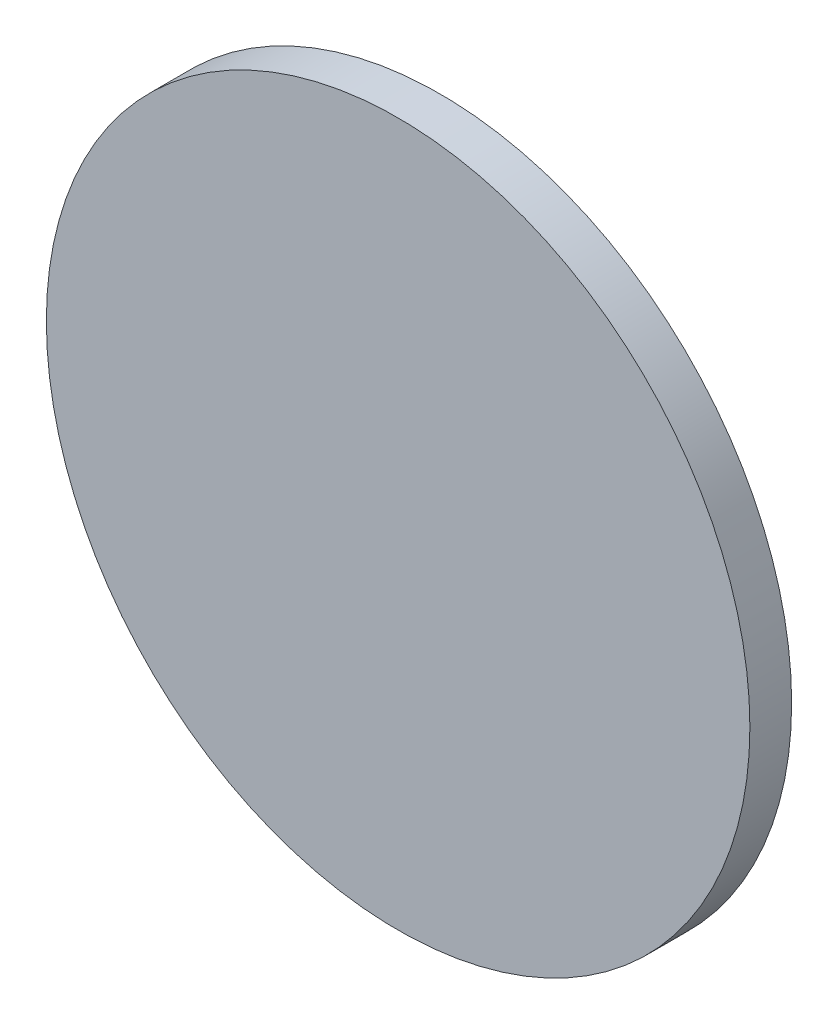
ISO-10303-21;
HEADER;
FILE_DESCRIPTION(('STEP AP214'),'2;1');
FILE_NAME('part.step','',(''),(''),'','','');
FILE_SCHEMA(('AUTOMOTIVE_DESIGN { 1 0 10303 214 1 1 1 1 }'));
ENDSEC;
DATA;
#1=APPLICATION_CONTEXT('core data for automotive mechanical design processes');
#2=APPLICATION_PROTOCOL_DEFINITION('international standard','automotive_design',2000,#1);
#3=PRODUCT_CONTEXT('',#1,'mechanical');
#4=PRODUCT('Part','Part','',(#3));
#5=PRODUCT_RELATED_PRODUCT_CATEGORY('part','',(#4));
#6=PRODUCT_DEFINITION_FORMATION('','',#4);
#7=PRODUCT_DEFINITION_CONTEXT('part definition',#1,'design');
#8=PRODUCT_DEFINITION('design','',#6,#7);
#9=PRODUCT_DEFINITION_SHAPE('','',#8);
#10=(LENGTH_UNIT() NAMED_UNIT(*) SI_UNIT(.MILLI.,.METRE.));
#11=(NAMED_UNIT(*) PLANE_ANGLE_UNIT() SI_UNIT($,.RADIAN.));
#12=(NAMED_UNIT(*) SI_UNIT($,.STERADIAN.) SOLID_ANGLE_UNIT());
#13=UNCERTAINTY_MEASURE_WITH_UNIT(LENGTH_MEASURE(1.E-05),#10,'distance_accuracy_value','');
#14=(GEOMETRIC_REPRESENTATION_CONTEXT(3) GLOBAL_UNCERTAINTY_ASSIGNED_CONTEXT((#13)) GLOBAL_UNIT_ASSIGNED_CONTEXT((#10,
#11,#12)) REPRESENTATION_CONTEXT('',''));
#15=CARTESIAN_POINT('',(0.,0.,0.));
#16=DIRECTION('',(0.,0.,1.));
#17=DIRECTION('',(1.,0.,0.));
#18=AXIS2_PLACEMENT_3D('',#15,#16,#17);
#19=CARTESIAN_POINT('',(0.,0.,10.));
#20=DIRECTION('',(0.,0.,-1.));
#21=DIRECTION('',(-1.,0.,0.));
#22=AXIS2_PLACEMENT_3D('',#19,#20,#21);
#23=CYLINDRICAL_SURFACE('',#22,84.251016630489);
#24=CARTESIAN_POINT('',(0.,0.,10.));
#25=DIRECTION('',(0.,0.,1.));
#26=DIRECTION('',(1.,0.,0.));
#27=AXIS2_PLACEMENT_3D('',#24,#25,#26);
#28=CIRCLE('',#27,84.251016630489);
#29=CARTESIAN_POINT('',(84.251016630489,0.,10.));
#30=VERTEX_POINT('',#29);
#31=EDGE_CURVE('E10',#30,#30,#28,.T.);
#32=ORIENTED_EDGE('',*,*,#31,.F.);
#33=EDGE_LOOP('',(#32));
#34=FACE_BOUND('',#33,.T.);
#35=CARTESIAN_POINT('',(0.,0.,0.));
#36=DIRECTION('',(0.,0.,1.));
#37=DIRECTION('',(1.,0.,0.));
#38=AXIS2_PLACEMENT_3D('',#35,#36,#37);
#39=CIRCLE('',#38,84.251016630489);
#40=CARTESIAN_POINT('',(84.251016630489,0.,0.));
#41=VERTEX_POINT('',#40);
#42=EDGE_CURVE('E34',#41,#41,#39,.T.);
#43=ORIENTED_EDGE('',*,*,#42,.T.);
#44=EDGE_LOOP('',(#43));
#45=FACE_BOUND('',#44,.T.);
#46=ADVANCED_FACE('F31',(#34,#45),#23,.T.);
#47=CARTESIAN_POINT('',(0.,0.,10.));
#48=DIRECTION('',(0.,0.,1.));
#49=DIRECTION('',(1.,0.,0.));
#50=AXIS2_PLACEMENT_3D('',#47,#48,#49);
#51=PLANE('',#50);
#52=ORIENTED_EDGE('',*,*,#31,.T.);
#53=EDGE_LOOP('',(#52));
#54=FACE_BOUND('',#53,.T.);
#55=ADVANCED_FACE('F46',(#54),#51,.T.);
#56=CARTESIAN_POINT('',(0.,0.,0.));
#57=DIRECTION('',(0.,0.,1.));
#58=DIRECTION('',(1.,0.,0.));
#59=AXIS2_PLACEMENT_3D('',#56,#57,#58);
#60=PLANE('',#59);
#61=ORIENTED_EDGE('',*,*,#42,.F.);
#62=EDGE_LOOP('',(#61));
#63=FACE_BOUND('',#62,.T.);
#64=ADVANCED_FACE('F44',(#63),#60,.F.);
#65=CLOSED_SHELL('',(#46,#55,#64));
#66=MANIFOLD_SOLID_BREP('B2',#65);
#67=ADVANCED_BREP_SHAPE_REPRESENTATION('',(#18,#66),#14);
#68=SHAPE_DEFINITION_REPRESENTATION(#9,#67);
ENDSEC;
END-ISO-10303-21;
